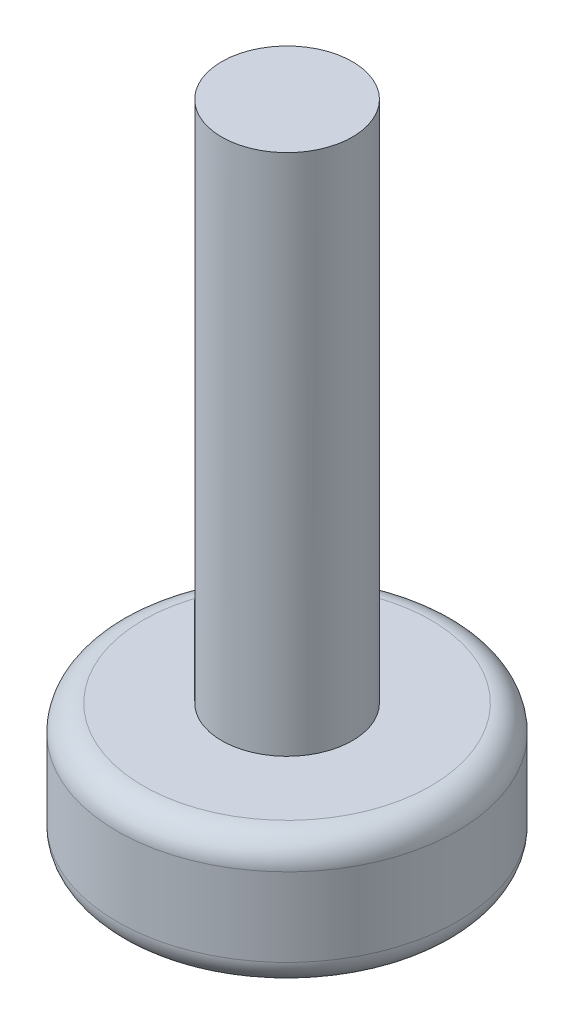
ISO-10303-21;
HEADER;
FILE_DESCRIPTION(('STEP AP214'),'2;1');
FILE_NAME('part.step','',(''),(''),'','','');
FILE_SCHEMA(('AUTOMOTIVE_DESIGN { 1 0 10303 214 1 1 1 1 }'));
ENDSEC;
DATA;
#1=APPLICATION_CONTEXT('core data for automotive mechanical design processes');
#2=APPLICATION_PROTOCOL_DEFINITION('international standard','automotive_design',2000,#1);
#3=PRODUCT_CONTEXT('',#1,'mechanical');
#4=PRODUCT('Part','Part','',(#3));
#5=PRODUCT_RELATED_PRODUCT_CATEGORY('part','',(#4));
#6=PRODUCT_DEFINITION_FORMATION('','',#4);
#7=PRODUCT_DEFINITION_CONTEXT('part definition',#1,'design');
#8=PRODUCT_DEFINITION('design','',#6,#7);
#9=PRODUCT_DEFINITION_SHAPE('','',#8);
#10=(LENGTH_UNIT() NAMED_UNIT(*) SI_UNIT(.MILLI.,.METRE.));
#11=(NAMED_UNIT(*) PLANE_ANGLE_UNIT() SI_UNIT($,.RADIAN.));
#12=(NAMED_UNIT(*) SI_UNIT($,.STERADIAN.) SOLID_ANGLE_UNIT());
#13=UNCERTAINTY_MEASURE_WITH_UNIT(LENGTH_MEASURE(1.E-05),#10,'distance_accuracy_value','');
#14=(GEOMETRIC_REPRESENTATION_CONTEXT(3) GLOBAL_UNCERTAINTY_ASSIGNED_CONTEXT((#13)) GLOBAL_UNIT_ASSIGNED_CONTEXT((#10,
#11,#12)) REPRESENTATION_CONTEXT('',''));
#15=CARTESIAN_POINT('',(0.,0.,0.));
#16=DIRECTION('',(0.,0.,1.));
#17=DIRECTION('',(1.,0.,0.));
#18=AXIS2_PLACEMENT_3D('',#15,#16,#17);
#19=CARTESIAN_POINT('',(0.,20.,0.));
#20=DIRECTION('',(0.,-1.,0.));
#21=DIRECTION('',(0.,0.,-1.));
#22=AXIS2_PLACEMENT_3D('',#19,#20,#21);
#23=CYLINDRICAL_SURFACE('',#22,2.5);
#24=CARTESIAN_POINT('',(0.,20.,0.));
#25=DIRECTION('',(0.,1.,0.));
#26=DIRECTION('',(0.,0.,1.));
#27=AXIS2_PLACEMENT_3D('',#24,#25,#26);
#28=CIRCLE('',#27,2.5);
#29=CARTESIAN_POINT('',(0.,20.,2.5));
#30=VERTEX_POINT('',#29);
#31=EDGE_CURVE('E10',#30,#30,#28,.T.);
#32=ORIENTED_EDGE('',*,*,#31,.F.);
#33=EDGE_LOOP('',(#32));
#34=FACE_BOUND('',#33,.T.);
#35=CARTESIAN_POINT('',(0.,0.,0.));
#36=DIRECTION('',(0.,1.,0.));
#37=DIRECTION('',(-1.,0.,0.));
#38=AXIS2_PLACEMENT_3D('',#35,#36,#37);
#39=CIRCLE('',#38,2.5);
#40=CARTESIAN_POINT('',(-2.5,0.,0.));
#41=VERTEX_POINT('',#40);
#42=EDGE_CURVE('E48',#41,#41,#39,.T.);
#43=ORIENTED_EDGE('',*,*,#42,.T.);
#44=EDGE_LOOP('',(#43));
#45=FACE_BOUND('',#44,.T.);
#46=ADVANCED_FACE('F41',(#34,#45),#23,.T.);
#47=CARTESIAN_POINT('',(0.,20.,0.));
#48=DIRECTION('',(0.,1.,0.));
#49=DIRECTION('',(0.,0.,1.));
#50=AXIS2_PLACEMENT_3D('',#47,#48,#49);
#51=PLANE('',#50);
#52=ORIENTED_EDGE('',*,*,#31,.T.);
#53=EDGE_LOOP('',(#52));
#54=FACE_BOUND('',#53,.T.);
#55=ADVANCED_FACE('F79',(#54),#51,.T.);
#56=CARTESIAN_POINT('',(0.,-4.,0.));
#57=DIRECTION('',(0.,1.,0.));
#58=DIRECTION('',(-1.,0.,0.));
#59=AXIS2_PLACEMENT_3D('',#56,#57,#58);
#60=TOROIDAL_SURFACE('',#59,5.5,1.);
#61=CARTESIAN_POINT('',(0.,-5.,0.));
#62=DIRECTION('',(0.,1.,0.));
#63=DIRECTION('',(-1.,0.,0.));
#64=AXIS2_PLACEMENT_3D('',#61,#62,#63);
#65=CIRCLE('',#64,5.5);
#66=CARTESIAN_POINT('',(-5.5,-5.,0.));
#67=VERTEX_POINT('',#66);
#68=EDGE_CURVE('E53',#67,#67,#65,.T.);
#69=ORIENTED_EDGE('',*,*,#68,.T.);
#70=EDGE_LOOP('',(#69));
#71=FACE_BOUND('',#70,.T.);
#72=CARTESIAN_POINT('',(0.,-4.,0.));
#73=DIRECTION('',(0.,1.,0.));
#74=DIRECTION('',(-1.,0.,0.));
#75=AXIS2_PLACEMENT_3D('',#72,#73,#74);
#76=CIRCLE('',#75,6.5);
#77=CARTESIAN_POINT('',(-6.5,-4.,0.));
#78=VERTEX_POINT('',#77);
#79=EDGE_CURVE('E68',#78,#78,#76,.T.);
#80=ORIENTED_EDGE('',*,*,#79,.F.);
#81=EDGE_LOOP('',(#80));
#82=FACE_BOUND('',#81,.T.);
#83=ADVANCED_FACE('F76',(#71,#82),#60,.T.);
#84=CARTESIAN_POINT('',(-5.5,-5.,0.));
#85=DIRECTION('',(0.,-1.,0.));
#86=DIRECTION('',(1.,0.,0.));
#87=AXIS2_PLACEMENT_3D('',#84,#85,#86);
#88=PLANE('',#87);
#89=ORIENTED_EDGE('',*,*,#68,.F.);
#90=EDGE_LOOP('',(#89));
#91=FACE_BOUND('',#90,.T.);
#92=ADVANCED_FACE('F78',(#91),#88,.T.);
#93=CARTESIAN_POINT('',(-5.5,0.,0.));
#94=DIRECTION('',(0.,1.,0.));
#95=DIRECTION('',(-1.,0.,0.));
#96=AXIS2_PLACEMENT_3D('',#93,#94,#95);
#97=PLANE('',#96);
#98=ORIENTED_EDGE('',*,*,#42,.F.);
#99=EDGE_LOOP('',(#98));
#100=FACE_BOUND('',#99,.T.);
#101=CARTESIAN_POINT('',(0.,0.,0.));
#102=DIRECTION('',(0.,1.,0.));
#103=DIRECTION('',(-1.,0.,0.));
#104=AXIS2_PLACEMENT_3D('',#101,#102,#103);
#105=CIRCLE('',#104,5.5);
#106=CARTESIAN_POINT('',(-5.5,0.,0.));
#107=VERTEX_POINT('',#106);
#108=EDGE_CURVE('E58',#107,#107,#105,.T.);
#109=ORIENTED_EDGE('',*,*,#108,.T.);
#110=EDGE_LOOP('',(#109));
#111=FACE_BOUND('',#110,.T.);
#112=ADVANCED_FACE('F86',(#100,#111),#97,.T.);
#113=CARTESIAN_POINT('',(0.,-0.999999999999999,0.));
#114=DIRECTION('',(0.,1.,0.));
#115=DIRECTION('',(-1.,0.,0.));
#116=AXIS2_PLACEMENT_3D('',#113,#114,#115);
#117=TOROIDAL_SURFACE('',#116,5.5,1.);
#118=CARTESIAN_POINT('',(0.,-0.999999999999999,0.));
#119=DIRECTION('',(0.,1.,0.));
#120=DIRECTION('',(-1.,0.,0.));
#121=AXIS2_PLACEMENT_3D('',#118,#119,#120);
#122=CIRCLE('',#121,6.5);
#123=CARTESIAN_POINT('',(-6.5,-1.,0.));
#124=VERTEX_POINT('',#123);
#125=EDGE_CURVE('E64',#124,#124,#122,.T.);
#126=ORIENTED_EDGE('',*,*,#125,.T.);
#127=EDGE_LOOP('',(#126));
#128=FACE_BOUND('',#127,.T.);
#129=ORIENTED_EDGE('',*,*,#108,.F.);
#130=EDGE_LOOP('',(#129));
#131=FACE_BOUND('',#130,.T.);
#132=ADVANCED_FACE('F126',(#128,#131),#117,.T.);
#133=CARTESIAN_POINT('',(0.,0.,0.));
#134=DIRECTION('',(0.,1.,0.));
#135=DIRECTION('',(-1.,0.,0.));
#136=AXIS2_PLACEMENT_3D('',#133,#134,#135);
#137=CYLINDRICAL_SURFACE('',#136,6.5);
#138=ORIENTED_EDGE('',*,*,#79,.T.);
#139=EDGE_LOOP('',(#138));
#140=FACE_BOUND('',#139,.T.);
#141=ORIENTED_EDGE('',*,*,#125,.F.);
#142=EDGE_LOOP('',(#141));
#143=FACE_BOUND('',#142,.T.);
#144=ADVANCED_FACE('F73',(#140,#143),#137,.T.);
#145=CLOSED_SHELL('',(#46,#55,#83,#92,#112,#132,#144));
#146=MANIFOLD_SOLID_BREP('B2',#145);
#147=ADVANCED_BREP_SHAPE_REPRESENTATION('',(#18,#146),#14);
#148=SHAPE_DEFINITION_REPRESENTATION(#9,#147);
ENDSEC;
END-ISO-10303-21;
